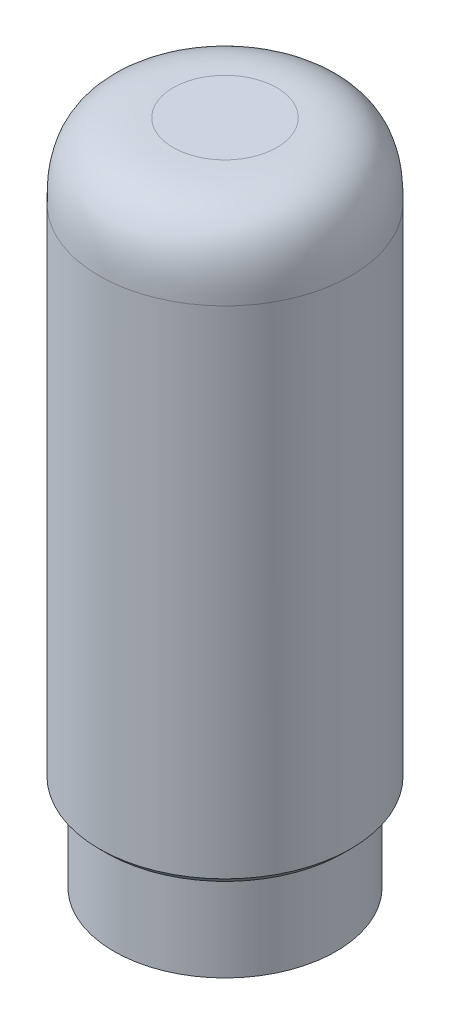
ISO-10303-21;
HEADER;
FILE_DESCRIPTION(('STEP AP214'),'2;1');
FILE_NAME('part.step','',(''),(''),'','','');
FILE_SCHEMA(('AUTOMOTIVE_DESIGN { 1 0 10303 214 1 1 1 1 }'));
ENDSEC;
DATA;
#1=APPLICATION_CONTEXT('core data for automotive mechanical design processes');
#2=APPLICATION_PROTOCOL_DEFINITION('international standard','automotive_design',2000,#1);
#3=PRODUCT_CONTEXT('',#1,'mechanical');
#4=PRODUCT('Part','Part','',(#3));
#5=PRODUCT_RELATED_PRODUCT_CATEGORY('part','',(#4));
#6=PRODUCT_DEFINITION_FORMATION('','',#4);
#7=PRODUCT_DEFINITION_CONTEXT('part definition',#1,'design');
#8=PRODUCT_DEFINITION('design','',#6,#7);
#9=PRODUCT_DEFINITION_SHAPE('','',#8);
#10=(LENGTH_UNIT() NAMED_UNIT(*) SI_UNIT(.MILLI.,.METRE.));
#11=(NAMED_UNIT(*) PLANE_ANGLE_UNIT() SI_UNIT($,.RADIAN.));
#12=(NAMED_UNIT(*) SI_UNIT($,.STERADIAN.) SOLID_ANGLE_UNIT());
#13=UNCERTAINTY_MEASURE_WITH_UNIT(LENGTH_MEASURE(1.E-05),#10,'distance_accuracy_value','');
#14=(GEOMETRIC_REPRESENTATION_CONTEXT(3) GLOBAL_UNCERTAINTY_ASSIGNED_CONTEXT((#13)) GLOBAL_UNIT_ASSIGNED_CONTEXT((#10,
#11,#12)) REPRESENTATION_CONTEXT('',''));
#15=CARTESIAN_POINT('',(0.,0.,0.));
#16=DIRECTION('',(0.,0.,1.));
#17=DIRECTION('',(1.,0.,0.));
#18=AXIS2_PLACEMENT_3D('',#15,#16,#17);
#19=CARTESIAN_POINT('',(0.,0.,0.));
#20=DIRECTION('',(0.,1.,0.));
#21=DIRECTION('',(-1.,0.,0.));
#22=AXIS2_PLACEMENT_3D('',#19,#20,#21);
#23=PLANE('',#22);
#24=CARTESIAN_POINT('',(0.,0.,0.));
#25=DIRECTION('',(0.,1.,0.));
#26=DIRECTION('',(-1.,0.,0.));
#27=AXIS2_PLACEMENT_3D('',#24,#25,#26);
#28=CIRCLE('',#27,15.);
#29=CARTESIAN_POINT('',(-15.,0.,0.));
#30=VERTEX_POINT('',#29);
#31=EDGE_CURVE('E121',#30,#30,#28,.T.);
#32=ORIENTED_EDGE('',*,*,#31,.F.);
#33=EDGE_LOOP('',(#32));
#34=FACE_BOUND('',#33,.T.);
#35=ADVANCED_FACE('F33',(#34),#23,.F.);
#36=CARTESIAN_POINT('',(0.,90.,0.));
#37=DIRECTION('',(0.,1.,0.));
#38=DIRECTION('',(-1.,0.,0.));
#39=AXIS2_PLACEMENT_3D('',#36,#37,#38);
#40=CYLINDRICAL_SURFACE('',#39,15.);
#41=CARTESIAN_POINT('',(0.,12.,0.));
#42=DIRECTION('',(0.,1.,0.));
#43=DIRECTION('',(-1.,0.,0.));
#44=AXIS2_PLACEMENT_3D('',#41,#42,#43);
#45=CIRCLE('',#44,15.);
#46=CARTESIAN_POINT('',(-15.,12.,0.));
#47=VERTEX_POINT('',#46);
#48=EDGE_CURVE('E118',#47,#47,#45,.T.);
#49=ORIENTED_EDGE('',*,*,#48,.F.);
#50=EDGE_LOOP('',(#49));
#51=FACE_BOUND('',#50,.T.);
#52=ORIENTED_EDGE('',*,*,#31,.T.);
#53=EDGE_LOOP('',(#52));
#54=FACE_BOUND('',#53,.T.);
#55=ADVANCED_FACE('F108',(#51,#54),#40,.T.);
#56=CARTESIAN_POINT('',(15.,12.,0.));
#57=DIRECTION('',(0.,1.,0.));
#58=DIRECTION('',(-1.,0.,0.));
#59=AXIS2_PLACEMENT_3D('',#56,#57,#58);
#60=PLANE('',#59);
#61=CARTESIAN_POINT('',(0.,12.,0.));
#62=DIRECTION('',(0.,1.,0.));
#63=DIRECTION('',(-1.,0.,0.));
#64=AXIS2_PLACEMENT_3D('',#61,#62,#63);
#65=CIRCLE('',#64,16.);
#66=CARTESIAN_POINT('',(-16.,12.,0.));
#67=VERTEX_POINT('',#66);
#68=EDGE_CURVE('E10',#67,#67,#65,.F.);
#69=ORIENTED_EDGE('',*,*,#68,.T.);
#70=EDGE_LOOP('',(#69));
#71=FACE_BOUND('',#70,.T.);
#72=ORIENTED_EDGE('',*,*,#48,.T.);
#73=EDGE_LOOP('',(#72));
#74=FACE_BOUND('',#73,.T.);
#75=ADVANCED_FACE('F105',(#71,#74),#60,.F.);
#76=CARTESIAN_POINT('',(0.,90.,0.));
#77=DIRECTION('',(0.,1.,0.));
#78=DIRECTION('',(-1.,0.,0.));
#79=AXIS2_PLACEMENT_3D('',#76,#77,#78);
#80=CYLINDRICAL_SURFACE('',#79,17.);
#81=CARTESIAN_POINT('',(0.,13.,0.));
#82=DIRECTION('',(0.,1.,0.));
#83=DIRECTION('',(-1.,0.,0.));
#84=AXIS2_PLACEMENT_3D('',#81,#82,#83);
#85=CIRCLE('',#84,17.);
#86=CARTESIAN_POINT('',(-17.,13.,0.));
#87=VERTEX_POINT('',#86);
#88=EDGE_CURVE('E40',#87,#87,#85,.T.);
#89=ORIENTED_EDGE('',*,*,#88,.T.);
#90=EDGE_LOOP('',(#89));
#91=FACE_BOUND('',#90,.T.);
#92=CARTESIAN_POINT('',(-17.,80.,0.));
#93=CARTESIAN_POINT('',(-17.,80.,2.22499534535164));
#94=CARTESIAN_POINT('',(-16.1148418168947,80.0000000000001,6.67498603605495));
#95=CARTESIAN_POINT('',(-12.3337659570196,80.,12.3337659570195));
#96=CARTESIAN_POINT('',(-6.6749860360549,80.,16.1148418168948));
#97=CARTESIAN_POINT('',(0.,80.,17.4425790915526));
#98=CARTESIAN_POINT('',(6.67498603605489,80.,16.1148418168948));
#99=CARTESIAN_POINT('',(12.3337659570195,80.,12.3337659570195));
#100=CARTESIAN_POINT('',(16.1148418168948,80.,6.67498603605491));
#101=CARTESIAN_POINT('',(17.4425790915526,80.,0.));
#102=CARTESIAN_POINT('',(16.1148418168948,80.,-6.6749860360549));
#103=CARTESIAN_POINT('',(12.3337659570196,80.,-12.3337659570195));
#104=CARTESIAN_POINT('',(6.6749860360549,80.,-16.1148418168948));
#105=CARTESIAN_POINT('',(0.,80.,-17.4425790915526));
#106=CARTESIAN_POINT('',(-6.67498603605496,80.,-16.1148418168947));
#107=CARTESIAN_POINT('',(-12.3337659570195,80.,-12.3337659570196));
#108=CARTESIAN_POINT('',(-16.1148418168948,80.,-6.67498603605486));
#109=CARTESIAN_POINT('',(-17.,80.,-2.22499534535163));
#110=CARTESIAN_POINT('',(-17.,80.,0.));
#111=B_SPLINE_CURVE_WITH_KNOTS('',3,(#92,#93,#94,#95,#96,#97,#98,#99,#100,#101,#102,#103,#104,
#105,#106,#107,#108,#109,#110),.UNSPECIFIED.,.T.,.F.,(4,1,1,1,1,1,1,1,1,1,1,1,1,1,1,1,4),
(-3.14159265358979,-2.74889357189107,-2.35619449019234,-1.96349540849362,-1.5707963267949,
-1.17809724509617,-0.785398163397448,-0.392699081698724,0.,0.392699081698724,0.785398163397448,
1.17809724509617,1.5707963267949,1.96349540849362,2.35619449019235,2.74889357189107,
3.14159265358979),.UNSPECIFIED.);
#112=CARTESIAN_POINT('',(-17.,80.,0.));
#113=VERTEX_POINT('',#112);
#114=EDGE_CURVE('E44',#113,#113,#111,.F.);
#115=ORIENTED_EDGE('',*,*,#114,.T.);
#116=EDGE_LOOP('',(#115));
#117=FACE_BOUND('',#116,.T.);
#118=ADVANCED_FACE('F95',(#91,#117),#80,.T.);
#119=CARTESIAN_POINT('',(17.,90.,0.));
#120=DIRECTION('',(0.,-1.,0.));
#121=DIRECTION('',(1.,0.,0.));
#122=AXIS2_PLACEMENT_3D('',#119,#120,#121);
#123=PLANE('',#122);
#124=CARTESIAN_POINT('',(-7.,90.,0.));
#125=CARTESIAN_POINT('',(-7.,90.,-0.91617455396832));
#126=CARTESIAN_POINT('',(-6.63552310107433,90.,-2.74852366190494));
#127=CARTESIAN_POINT('',(-5.07860951171391,90.,-5.07860951171394));
#128=CARTESIAN_POINT('',(-2.74852366190498,90.,-6.63552310107431));
#129=CARTESIAN_POINT('',(0.,90.,-7.18223844946284));
#130=CARTESIAN_POINT('',(2.74852366190496,90.,-6.63552310107432));
#131=CARTESIAN_POINT('',(5.07860951171394,90.,-5.07860951171393));
#132=CARTESIAN_POINT('',(6.63552310107432,90.,-2.74852366190496));
#133=CARTESIAN_POINT('',(7.18223844946284,90.,0.));
#134=CARTESIAN_POINT('',(6.63552310107432,90.,2.74852366190496));
#135=CARTESIAN_POINT('',(5.07860951171393,90.,5.07860951171393));
#136=CARTESIAN_POINT('',(2.74852366190496,90.,6.63552310107432));
#137=CARTESIAN_POINT('',(0.,90.,7.18223844946284));
#138=CARTESIAN_POINT('',(-2.74852366190496,90.,6.63552310107432));
#139=CARTESIAN_POINT('',(-5.07860951171393,90.,5.07860951171392));
#140=CARTESIAN_POINT('',(-6.63552310107431,90.,2.74852366190498));
#141=CARTESIAN_POINT('',(-6.99999999999999,90.,0.916174553968322));
#142=CARTESIAN_POINT('',(-7.,90.,0.));
#143=B_SPLINE_CURVE_WITH_KNOTS('',3,(#124,#125,#126,#127,#128,#129,#130,#131,#132,#133,#134,
#135,#136,#137,#138,#139,#140,#141,#142),.UNSPECIFIED.,.T.,.F.,(4,1,1,1,1,1,1,1,1,1,1,1,1,1,1,1,
4),(-3.14159265358979,-2.74889357189107,-2.35619449019235,-1.96349540849362,-1.5707963267949,
-1.17809724509617,-0.785398163397448,-0.392699081698724,0.,0.392699081698724,0.785398163397448,
1.17809724509617,1.5707963267949,1.96349540849362,2.35619449019234,2.74889357189107,
3.14159265358979),.UNSPECIFIED.);
#144=CARTESIAN_POINT('',(-7.,90.,0.));
#145=VERTEX_POINT('',#144);
#146=EDGE_CURVE('E48',#145,#145,#143,.F.);
#147=ORIENTED_EDGE('',*,*,#146,.T.);
#148=EDGE_LOOP('',(#147));
#149=FACE_BOUND('',#148,.T.);
#150=ADVANCED_FACE('F69',(#149),#123,.F.);
#151=CARTESIAN_POINT('',(-17.,80.,0.));
#152=CARTESIAN_POINT('',(-17.,80.,-2.22499534535163));
#153=CARTESIAN_POINT('',(-16.1148418168948,80.,-6.67498603605486));
#154=CARTESIAN_POINT('',(-12.3337659570195,80.,-12.3337659570196));
#155=CARTESIAN_POINT('',(-6.67498603605496,80.,-16.1148418168947));
#156=CARTESIAN_POINT('',(0.,80.,-17.4425790915526));
#157=CARTESIAN_POINT('',(6.6749860360549,80.,-16.1148418168948));
#158=CARTESIAN_POINT('',(12.3337659570196,80.,-12.3337659570195));
#159=CARTESIAN_POINT('',(16.1148418168948,80.,-6.6749860360549));
#160=CARTESIAN_POINT('',(17.4425790915526,80.,0.));
#161=CARTESIAN_POINT('',(16.1148418168948,80.,6.67498603605491));
#162=CARTESIAN_POINT('',(12.3337659570195,80.,12.3337659570195));
#163=CARTESIAN_POINT('',(6.67498603605489,80.,16.1148418168948));
#164=CARTESIAN_POINT('',(0.,80.,17.4425790915526));
#165=CARTESIAN_POINT('',(-6.6749860360549,80.,16.1148418168948));
#166=CARTESIAN_POINT('',(-12.3337659570196,80.,12.3337659570195));
#167=CARTESIAN_POINT('',(-16.1148418168947,80.0000000000001,6.67498603605495));
#168=CARTESIAN_POINT('',(-17.,80.,2.22499534535164));
#169=CARTESIAN_POINT('',(-17.,80.,0.));
#170=CARTESIAN_POINT('',(-17.,81.6819805153394,0.));
#171=CARTESIAN_POINT('',(-17.,81.6819805153394,-2.22499534535163));
#172=CARTESIAN_POINT('',(-16.1148418168948,81.6819805153395,-6.67498603605486));
#173=CARTESIAN_POINT('',(-12.3337659570195,81.6819805153394,-12.3337659570196));
#174=CARTESIAN_POINT('',(-6.67498603605496,81.6819805153395,-16.1148418168947));
#175=CARTESIAN_POINT('',(0.,81.6819805153395,-17.4425790915526));
#176=CARTESIAN_POINT('',(6.6749860360549,81.6819805153394,-16.1148418168948));
#177=CARTESIAN_POINT('',(12.3337659570196,81.6819805153395,-12.3337659570195));
#178=CARTESIAN_POINT('',(16.1148418168948,81.6819805153394,-6.6749860360549));
#179=CARTESIAN_POINT('',(17.4425790915526,81.6819805153395,0.));
#180=CARTESIAN_POINT('',(16.1148418168948,81.6819805153394,6.67498603605491));
#181=CARTESIAN_POINT('',(12.3337659570195,81.6819805153395,12.3337659570195));
#182=CARTESIAN_POINT('',(6.67498603605489,81.6819805153394,16.1148418168948));
#183=CARTESIAN_POINT('',(0.,81.6819805153395,17.4425790915526));
#184=CARTESIAN_POINT('',(-6.6749860360549,81.6819805153395,16.1148418168948));
#185=CARTESIAN_POINT('',(-12.3337659570196,81.6819805153394,12.3337659570195));
#186=CARTESIAN_POINT('',(-16.1148418168947,81.6819805153395,6.67498603605495));
#187=CARTESIAN_POINT('',(-17.,81.6819805153395,2.22499534535164));
#188=CARTESIAN_POINT('',(-17.,81.6819805153394,0.));
#189=CARTESIAN_POINT('',(-17.,83.3639610306789,0.));
#190=CARTESIAN_POINT('',(-17.,83.3639610306789,-2.22499534535163));
#191=CARTESIAN_POINT('',(-16.1148418168948,83.363961030679,-6.67498603605486));
#192=CARTESIAN_POINT('',(-12.3337659570195,83.3639610306789,-12.3337659570196));
#193=CARTESIAN_POINT('',(-6.67498603605496,83.363961030679,-16.1148418168947));
#194=CARTESIAN_POINT('',(0.,83.363961030679,-17.4425790915526));
#195=CARTESIAN_POINT('',(6.6749860360549,83.3639610306789,-16.1148418168948));
#196=CARTESIAN_POINT('',(12.3337659570196,83.363961030679,-12.3337659570195));
#197=CARTESIAN_POINT('',(16.1148418168948,83.3639610306789,-6.6749860360549));
#198=CARTESIAN_POINT('',(17.4425790915526,83.363961030679,0.));
#199=CARTESIAN_POINT('',(16.1148418168948,83.3639610306789,6.6749860360549));
#200=CARTESIAN_POINT('',(12.3337659570195,83.363961030679,12.3337659570195));
#201=CARTESIAN_POINT('',(6.67498603605489,83.3639610306789,16.1148418168948));
#202=CARTESIAN_POINT('',(0.,83.3639610306789,17.4425790915526));
#203=CARTESIAN_POINT('',(-6.6749860360549,83.3639610306789,16.1148418168948));
#204=CARTESIAN_POINT('',(-12.3337659570196,83.3639610306789,12.3337659570195));
#205=CARTESIAN_POINT('',(-16.1148418168947,83.363961030679,6.67498603605495));
#206=CARTESIAN_POINT('',(-17.,83.3639610306789,2.22499534535164));
#207=CARTESIAN_POINT('',(-17.,83.3639610306789,0.));
#208=CARTESIAN_POINT('',(-16.2830808016392,87.0710678118654,0.));
#209=CARTESIAN_POINT('',(-16.2830808016392,87.0710678118654,-2.13116347009598));
#210=CARTESIAN_POINT('',(-15.4352512594195,87.0710678118655,-6.3934904102879));
#211=CARTESIAN_POINT('',(-11.8136298627444,87.0710678118654,-11.8136298627445));
#212=CARTESIAN_POINT('',(-6.393490410288,87.0710678118655,-15.4352512594195));
#213=CARTESIAN_POINT('',(0.,87.0710678118655,-16.706995572749));
#214=CARTESIAN_POINT('',(6.39349041028796,87.0710678118654,-15.4352512594195));
#215=CARTESIAN_POINT('',(11.8136298627445,87.0710678118655,-11.8136298627444));
#216=CARTESIAN_POINT('',(15.4352512594195,87.0710678118654,-6.39349041028795));
#217=CARTESIAN_POINT('',(16.706995572749,87.0710678118654,0.));
#218=CARTESIAN_POINT('',(15.4352512594195,87.0710678118654,6.39349041028795));
#219=CARTESIAN_POINT('',(11.8136298627444,87.0710678118654,11.8136298627444));
#220=CARTESIAN_POINT('',(6.39349041028794,87.0710678118654,15.4352512594195));
#221=CARTESIAN_POINT('',(0.,87.0710678118654,16.706995572749));
#222=CARTESIAN_POINT('',(-6.39349041028795,87.0710678118655,15.4352512594195));
#223=CARTESIAN_POINT('',(-11.8136298627445,87.0710678118654,11.8136298627444));
#224=CARTESIAN_POINT('',(-15.4352512594195,87.0710678118655,6.39349041028799));
#225=CARTESIAN_POINT('',(-16.2830808016392,87.0710678118654,2.13116347009599));
#226=CARTESIAN_POINT('',(-16.2830808016392,87.0710678118654,0.));
#227=CARTESIAN_POINT('',(-14.0710678118655,89.2830808016392,0.));
#228=CARTESIAN_POINT('',(-14.0710678118655,89.2830808016391,-1.8416506109134));
#229=CARTESIAN_POINT('',(-13.3384136460595,89.2830808016392,-5.52495183274018));
#230=CARTESIAN_POINT('',(-10.2087798327588,89.2830808016391,-10.2087798327588));
#231=CARTESIAN_POINT('',(-5.52495183274026,89.2830808016392,-13.3384136460595));
#232=CARTESIAN_POINT('',(0.,89.2830808016392,-14.4373948947685));
#233=CARTESIAN_POINT('',(5.52495183274021,89.2830808016392,-13.3384136460595));
#234=CARTESIAN_POINT('',(10.2087798327588,89.2830808016392,-10.2087798327588));
#235=CARTESIAN_POINT('',(13.3384136460595,89.2830808016392,-5.5249518327402));
#236=CARTESIAN_POINT('',(14.4373948947685,89.2830808016392,0.));
#237=CARTESIAN_POINT('',(13.3384136460595,89.2830808016392,5.52495183274022));
#238=CARTESIAN_POINT('',(10.2087798327588,89.2830808016392,10.2087798327588));
#239=CARTESIAN_POINT('',(5.52495183274021,89.2830808016392,13.3384136460595));
#240=CARTESIAN_POINT('',(0.,89.2830808016391,14.4373948947685));
#241=CARTESIAN_POINT('',(-5.52495183274022,89.2830808016392,13.3384136460595));
#242=CARTESIAN_POINT('',(-10.2087798327588,89.2830808016391,10.2087798327588));
#243=CARTESIAN_POINT('',(-13.3384136460595,89.2830808016392,5.52495183274026));
#244=CARTESIAN_POINT('',(-14.0710678118655,89.2830808016392,1.84165061091341));
#245=CARTESIAN_POINT('',(-14.0710678118655,89.2830808016392,0.));
#246=CARTESIAN_POINT('',(-10.3639610306789,90.,0.));
#247=CARTESIAN_POINT('',(-10.3639610306789,90.,-1.3564567678039));
#248=CARTESIAN_POINT('',(-9.82432897681486,90.,-4.06937030341168));
#249=CARTESIAN_POINT('',(-7.51921586706261,90.,-7.51921586706265));
#250=CARTESIAN_POINT('',(-4.06937030341174,90.,-9.82432897681485));
#251=CARTESIAN_POINT('',(0.,90.,-10.633777057611));
#252=CARTESIAN_POINT('',(4.0693703034117,90.,-9.82432897681485));
#253=CARTESIAN_POINT('',(7.51921586706265,90.,-7.51921586706263));
#254=CARTESIAN_POINT('',(9.82432897681485,90.,-4.0693703034117));
#255=CARTESIAN_POINT('',(10.633777057611,90.,0.));
#256=CARTESIAN_POINT('',(9.82432897681486,90.,4.0693703034117));
#257=CARTESIAN_POINT('',(7.51921586706264,90.,7.51921586706264));
#258=CARTESIAN_POINT('',(4.0693703034117,90.,9.82432897681485));
#259=CARTESIAN_POINT('',(0.,90.,10.633777057611));
#260=CARTESIAN_POINT('',(-4.0693703034117,90.,9.82432897681486));
#261=CARTESIAN_POINT('',(-7.51921586706264,90.,7.51921586706262));
#262=CARTESIAN_POINT('',(-9.82432897681484,90.,4.06937030341174));
#263=CARTESIAN_POINT('',(-10.3639610306789,90.,1.3564567678039));
#264=CARTESIAN_POINT('',(-10.3639610306789,90.,0.));
#265=CARTESIAN_POINT('',(-8.68198051533946,90.,0.));
#266=CARTESIAN_POINT('',(-8.68198051533946,90.,-1.13631566088611));
#267=CARTESIAN_POINT('',(-8.22992603894459,90.,-3.40894698265831));
#268=CARTESIAN_POINT('',(-6.29891268938826,90.,-6.2989126893883));
#269=CARTESIAN_POINT('',(-3.40894698265836,90.,-8.22992603894458));
#270=CARTESIAN_POINT('',(0.,90.,-8.9080077535369));
#271=CARTESIAN_POINT('',(3.40894698265833,90.,-8.22992603894458));
#272=CARTESIAN_POINT('',(6.29891268938829,90.,-6.29891268938828));
#273=CARTESIAN_POINT('',(8.22992603894459,90.,-3.40894698265833));
#274=CARTESIAN_POINT('',(8.9080077535369,90.,0.));
#275=CARTESIAN_POINT('',(8.22992603894459,90.,3.40894698265833));
#276=CARTESIAN_POINT('',(6.29891268938829,90.,6.29891268938829));
#277=CARTESIAN_POINT('',(3.40894698265833,90.,8.22992603894459));
#278=CARTESIAN_POINT('',(0.,90.,8.90800775353689));
#279=CARTESIAN_POINT('',(-3.40894698265833,90.,8.22992603894459));
#280=CARTESIAN_POINT('',(-6.29891268938829,90.,6.29891268938827));
#281=CARTESIAN_POINT('',(-8.22992603894458,90.,3.40894698265836));
#282=CARTESIAN_POINT('',(-8.68198051533946,90.,1.13631566088611));
#283=CARTESIAN_POINT('',(-8.68198051533946,90.,0.));
#284=CARTESIAN_POINT('',(-7.,90.,0.));
#285=CARTESIAN_POINT('',(-7.,90.,-0.91617455396832));
#286=CARTESIAN_POINT('',(-6.63552310107433,90.,-2.74852366190494));
#287=CARTESIAN_POINT('',(-5.07860951171391,90.,-5.07860951171394));
#288=CARTESIAN_POINT('',(-2.74852366190498,90.,-6.63552310107431));
#289=CARTESIAN_POINT('',(0.,90.,-7.18223844946284));
#290=CARTESIAN_POINT('',(2.74852366190496,90.,-6.63552310107432));
#291=CARTESIAN_POINT('',(5.07860951171394,90.,-5.07860951171393));
#292=CARTESIAN_POINT('',(6.63552310107432,90.,-2.74852366190496));
#293=CARTESIAN_POINT('',(7.18223844946284,90.,0.));
#294=CARTESIAN_POINT('',(6.63552310107432,90.,2.74852366190496));
#295=CARTESIAN_POINT('',(5.07860951171393,90.,5.07860951171393));
#296=CARTESIAN_POINT('',(2.74852366190496,90.,6.63552310107432));
#297=CARTESIAN_POINT('',(0.,90.,7.18223844946284));
#298=CARTESIAN_POINT('',(-2.74852366190496,90.,6.63552310107432));
#299=CARTESIAN_POINT('',(-5.07860951171393,90.,5.07860951171392));
#300=CARTESIAN_POINT('',(-6.63552310107431,90.,2.74852366190498));
#301=CARTESIAN_POINT('',(-6.99999999999999,90.,0.916174553968322));
#302=CARTESIAN_POINT('',(-7.,90.,0.));
#303=B_SPLINE_SURFACE_WITH_KNOTS('',5,3,((#151,#152,#153,#154,#155,#156,#157,#158,#159,#160,
#161,#162,#163,#164,#165,#166,#167,#168,#169),(#170,#171,#172,#173,#174,#175,#176,#177,#178,
#179,#180,#181,#182,#183,#184,#185,#186,#187,#188),(#189,#190,#191,#192,#193,#194,#195,#196,
#197,#198,#199,#200,#201,#202,#203,#204,#205,#206,#207),(#208,#209,#210,#211,#212,#213,#214,
#215,#216,#217,#218,#219,#220,#221,#222,#223,#224,#225,#226),(#227,#228,#229,#230,#231,#232,
#233,#234,#235,#236,#237,#238,#239,#240,#241,#242,#243,#244,#245),(#246,#247,#248,#249,#250,
#251,#252,#253,#254,#255,#256,#257,#258,#259,#260,#261,#262,#263,#264),(#265,#266,#267,#268,
#269,#270,#271,#272,#273,#274,#275,#276,#277,#278,#279,#280,#281,#282,#283),(#284,#285,#286,
#287,#288,#289,#290,#291,#292,#293,#294,#295,#296,#297,#298,#299,#300,#301,#302)),.UNSPECIFIED.,
.F.,.T.,.F.,(6,2,6),(4,1,1,1,1,1,1,1,1,1,1,1,1,1,1,1,4),(0.,0.5,1.),(-3.14159265358979,
-2.74889357189107,-2.35619449019235,-1.96349540849362,-1.5707963267949,-1.17809724509617,
-0.785398163397448,-0.392699081698724,0.,0.392699081698724,0.785398163397448,1.17809724509617,
1.5707963267949,1.96349540849362,2.35619449019234,2.74889357189107,3.14159265358979),.UNSPECIFIED.);
#304=ORIENTED_EDGE('',*,*,#114,.F.);
#305=EDGE_LOOP('',(#304));
#306=FACE_BOUND('',#305,.T.);
#307=ORIENTED_EDGE('',*,*,#146,.F.);
#308=EDGE_LOOP('',(#307));
#309=FACE_BOUND('',#308,.T.);
#310=ADVANCED_FACE('F56',(#306,#309),#303,.T.);
#311=CARTESIAN_POINT('',(0.,13.,0.));
#312=DIRECTION('',(0.,1.,0.));
#313=DIRECTION('',(-1.,0.,0.));
#314=AXIS2_PLACEMENT_3D('',#311,#312,#313);
#315=CONICAL_SURFACE('',#314,17.,0.785398163397448);
#316=ORIENTED_EDGE('',*,*,#68,.F.);
#317=EDGE_LOOP('',(#316));
#318=FACE_BOUND('',#317,.T.);
#319=ORIENTED_EDGE('',*,*,#88,.F.);
#320=EDGE_LOOP('',(#319));
#321=FACE_BOUND('',#320,.T.);
#322=ADVANCED_FACE('F35',(#318,#321),#315,.T.);
#323=CLOSED_SHELL('',(#35,#55,#75,#118,#150,#310,#322));
#324=MANIFOLD_SOLID_BREP('B2',#323);
#325=ADVANCED_BREP_SHAPE_REPRESENTATION('',(#18,#324),#14);
#326=SHAPE_DEFINITION_REPRESENTATION(#9,#325);
ENDSEC;
END-ISO-10303-21;
